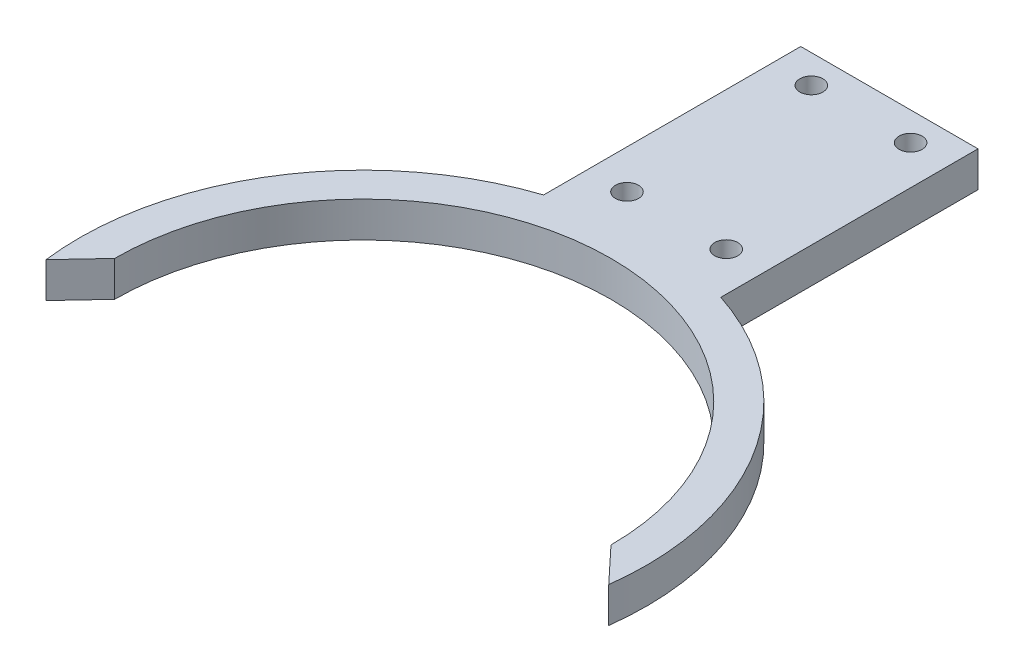
ISO-10303-21;
HEADER;
FILE_DESCRIPTION(('STEP AP214'),'2;1');
FILE_NAME('part.step','',(''),(''),'','','');
FILE_SCHEMA(('AUTOMOTIVE_DESIGN { 1 0 10303 214 1 1 1 1 }'));
ENDSEC;
DATA;
#1=APPLICATION_CONTEXT('core data for automotive mechanical design processes');
#2=APPLICATION_PROTOCOL_DEFINITION('international standard','automotive_design',2000,#1);
#3=PRODUCT_CONTEXT('',#1,'mechanical');
#4=PRODUCT('Part','Part','',(#3));
#5=PRODUCT_RELATED_PRODUCT_CATEGORY('part','',(#4));
#6=PRODUCT_DEFINITION_FORMATION('','',#4);
#7=PRODUCT_DEFINITION_CONTEXT('part definition',#1,'design');
#8=PRODUCT_DEFINITION('design','',#6,#7);
#9=PRODUCT_DEFINITION_SHAPE('','',#8);
#10=(LENGTH_UNIT() NAMED_UNIT(*) SI_UNIT(.MILLI.,.METRE.));
#11=(NAMED_UNIT(*) PLANE_ANGLE_UNIT() SI_UNIT($,.RADIAN.));
#12=(NAMED_UNIT(*) SI_UNIT($,.STERADIAN.) SOLID_ANGLE_UNIT());
#13=UNCERTAINTY_MEASURE_WITH_UNIT(LENGTH_MEASURE(1.E-05),#10,'distance_accuracy_value','');
#14=(GEOMETRIC_REPRESENTATION_CONTEXT(3) GLOBAL_UNCERTAINTY_ASSIGNED_CONTEXT((#13)) GLOBAL_UNIT_ASSIGNED_CONTEXT((#10,
#11,#12)) REPRESENTATION_CONTEXT('',''));
#15=CARTESIAN_POINT('',(0.,0.,0.));
#16=DIRECTION('',(0.,0.,1.));
#17=DIRECTION('',(1.,0.,0.));
#18=AXIS2_PLACEMENT_3D('',#15,#16,#17);
#19=CARTESIAN_POINT('',(2.5,5.,34.2668769218525));
#20=DIRECTION('',(0.,-1.,0.));
#21=DIRECTION('',(0.,0.,-1.));
#22=AXIS2_PLACEMENT_3D('',#19,#20,#21);
#23=PLANE('',#22);
#24=CARTESIAN_POINT('',(9.49999999999999,5.,-35.992204685627));
#25=DIRECTION('',(0.,1.,0.));
#26=DIRECTION('',(0.,0.,-1.));
#27=AXIS2_PLACEMENT_3D('',#24,#25,#26);
#28=CIRCLE('',#27,1.625);
#29=CARTESIAN_POINT('',(9.49999999999999,5.,-37.617204685627));
#30=VERTEX_POINT('',#29);
#31=EDGE_CURVE('E188',#30,#30,#28,.T.);
#32=ORIENTED_EDGE('',*,*,#31,.F.);
#33=EDGE_LOOP('',(#32));
#34=FACE_BOUND('',#33,.T.);
#35=CARTESIAN_POINT('',(-4.50000000000001,5.,-9.992204685627));
#36=DIRECTION('',(0.,1.,0.));
#37=DIRECTION('',(0.,0.,1.));
#38=AXIS2_PLACEMENT_3D('',#35,#36,#37);
#39=CIRCLE('',#38,1.625);
#40=CARTESIAN_POINT('',(-4.50000000000001,5.,-8.367204685627));
#41=VERTEX_POINT('',#40);
#42=EDGE_CURVE('E134',#41,#41,#39,.T.);
#43=ORIENTED_EDGE('',*,*,#42,.F.);
#44=EDGE_LOOP('',(#43));
#45=FACE_BOUND('',#44,.T.);
#46=DIRECTION('',(0.,0.,-1.));
#47=VECTOR('',#46,1.);
#48=CARTESIAN_POINT('',(15.,5.,-40.));
#49=LINE('',#48,#47);
#50=CARTESIAN_POINT('',(15.,5.,-3.72983346207416));
#51=VERTEX_POINT('',#50);
#52=CARTESIAN_POINT('',(15.,5.,-40.));
#53=VERTEX_POINT('',#52);
#54=EDGE_CURVE('E145',#51,#53,#49,.T.);
#55=ORIENTED_EDGE('',*,*,#54,.T.);
#56=DIRECTION('',(-1.,0.,0.));
#57=VECTOR('',#56,1.);
#58=CARTESIAN_POINT('',(15.,5.,-40.));
#59=LINE('',#58,#57);
#60=CARTESIAN_POINT('',(-10.,5.,-40.));
#61=VERTEX_POINT('',#60);
#62=EDGE_CURVE('E93',#53,#61,#59,.T.);
#63=ORIENTED_EDGE('',*,*,#62,.T.);
#64=DIRECTION('',(0.,0.,1.));
#65=VECTOR('',#64,1.);
#66=CARTESIAN_POINT('',(-10.,5.,-40.));
#67=LINE('',#66,#65);
#68=CARTESIAN_POINT('',(-10.,5.,-3.72983346207416));
#69=VERTEX_POINT('',#68);
#70=EDGE_CURVE('E160',#61,#69,#67,.T.);
#71=ORIENTED_EDGE('',*,*,#70,.T.);
#72=CARTESIAN_POINT('',(2.5,5.,34.2668769218525));
#73=DIRECTION('',(0.,1.,0.));
#74=DIRECTION('',(0.,0.,1.));
#75=AXIS2_PLACEMENT_3D('',#72,#73,#74);
#76=CIRCLE('',#75,40.);
#77=CARTESIAN_POINT('',(-37.1862696659689,5.,39.2668769218525));
#78=VERTEX_POINT('',#77);
#79=EDGE_CURVE('E173',#69,#78,#76,.T.);
#80=ORIENTED_EDGE('',*,*,#79,.T.);
#81=DIRECTION('',(0.683845569055321,0.,-0.729626779719196));
#82=VECTOR('',#81,1.);
#83=CARTESIAN_POINT('',(-32.5,5.,34.2668769218525));
#84=LINE('',#83,#82);
#85=CARTESIAN_POINT('',(-32.5,5.,34.2668769218525));
#86=VERTEX_POINT('',#85);
#87=EDGE_CURVE('E112',#78,#86,#84,.T.);
#88=ORIENTED_EDGE('',*,*,#87,.T.);
#89=CARTESIAN_POINT('',(2.5,5.,34.2668769218525));
#90=DIRECTION('',(0.,-1.,0.));
#91=DIRECTION('',(0.,0.,1.));
#92=AXIS2_PLACEMENT_3D('',#89,#90,#91);
#93=CIRCLE('',#92,35.);
#94=CARTESIAN_POINT('',(37.5,5.,34.2668769218525));
#95=VERTEX_POINT('',#94);
#96=EDGE_CURVE('E106',#86,#95,#93,.T.);
#97=ORIENTED_EDGE('',*,*,#96,.T.);
#98=DIRECTION('',(0.683845569055321,0.,0.729626779719196));
#99=VECTOR('',#98,1.);
#100=CARTESIAN_POINT('',(37.5,5.,34.2668769218525));
#101=LINE('',#100,#99);
#102=CARTESIAN_POINT('',(42.1862696659689,5.,39.2668769218525));
#103=VERTEX_POINT('',#102);
#104=EDGE_CURVE('E110',#95,#103,#101,.T.);
#105=ORIENTED_EDGE('',*,*,#104,.T.);
#106=CARTESIAN_POINT('',(2.5,5.,34.2668769218525));
#107=DIRECTION('',(0.,1.,0.));
#108=DIRECTION('',(0.,0.,-1.));
#109=AXIS2_PLACEMENT_3D('',#106,#107,#108);
#110=CIRCLE('',#109,40.);
#111=EDGE_CURVE('E50',#103,#51,#110,.T.);
#112=ORIENTED_EDGE('',*,*,#111,.T.);
#113=EDGE_LOOP('',(#55,#63,#71,#80,#88,#97,#105,#112));
#114=FACE_BOUND('',#113,.T.);
#115=CARTESIAN_POINT('',(-4.50000000000001,5.,-35.992204685627));
#116=DIRECTION('',(0.,1.,0.));
#117=DIRECTION('',(0.,0.,1.));
#118=AXIS2_PLACEMENT_3D('',#115,#116,#117);
#119=CIRCLE('',#118,1.625);
#120=CARTESIAN_POINT('',(-4.50000000000001,5.,-34.367204685627));
#121=VERTEX_POINT('',#120);
#122=EDGE_CURVE('E182',#121,#121,#119,.T.);
#123=ORIENTED_EDGE('',*,*,#122,.F.);
#124=EDGE_LOOP('',(#123));
#125=FACE_BOUND('',#124,.T.);
#126=CARTESIAN_POINT('',(9.5,5.,-9.992204685627));
#127=DIRECTION('',(0.,1.,0.));
#128=DIRECTION('',(0.,0.,-1.));
#129=AXIS2_PLACEMENT_3D('',#126,#127,#128);
#130=CIRCLE('',#129,1.625);
#131=CARTESIAN_POINT('',(9.5,5.,-11.617204685627));
#132=VERTEX_POINT('',#131);
#133=EDGE_CURVE('E194',#132,#132,#130,.T.);
#134=ORIENTED_EDGE('',*,*,#133,.F.);
#135=EDGE_LOOP('',(#134));
#136=FACE_BOUND('',#135,.T.);
#137=ADVANCED_FACE('F33',(#34,#45,#114,#125,#136),#23,.F.);
#138=CARTESIAN_POINT('',(2.5,0.,34.2668769218525));
#139=DIRECTION('',(0.,-1.,0.));
#140=DIRECTION('',(0.,0.,-1.));
#141=AXIS2_PLACEMENT_3D('',#138,#139,#140);
#142=PLANE('',#141);
#143=CARTESIAN_POINT('',(9.49999999999999,0.,-35.992204685627));
#144=DIRECTION('',(0.,1.,0.));
#145=DIRECTION('',(0.,0.,-1.));
#146=AXIS2_PLACEMENT_3D('',#143,#144,#145);
#147=CIRCLE('',#146,1.625);
#148=CARTESIAN_POINT('',(9.49999999999999,0.,-37.617204685627));
#149=VERTEX_POINT('',#148);
#150=EDGE_CURVE('E191',#149,#149,#147,.T.);
#151=ORIENTED_EDGE('',*,*,#150,.T.);
#152=EDGE_LOOP('',(#151));
#153=FACE_BOUND('',#152,.T.);
#154=CARTESIAN_POINT('',(-4.50000000000001,0.,-9.992204685627));
#155=DIRECTION('',(0.,1.,0.));
#156=DIRECTION('',(0.,0.,1.));
#157=AXIS2_PLACEMENT_3D('',#154,#155,#156);
#158=CIRCLE('',#157,1.625);
#159=CARTESIAN_POINT('',(-4.50000000000001,0.,-8.367204685627));
#160=VERTEX_POINT('',#159);
#161=EDGE_CURVE('E179',#160,#160,#158,.T.);
#162=ORIENTED_EDGE('',*,*,#161,.T.);
#163=EDGE_LOOP('',(#162));
#164=FACE_BOUND('',#163,.T.);
#165=DIRECTION('',(0.,0.,-1.));
#166=VECTOR('',#165,1.);
#167=CARTESIAN_POINT('',(15.,0.,-40.));
#168=LINE('',#167,#166);
#169=CARTESIAN_POINT('',(15.,0.,-3.72983346207416));
#170=VERTEX_POINT('',#169);
#171=CARTESIAN_POINT('',(15.,0.,-40.));
#172=VERTEX_POINT('',#171);
#173=EDGE_CURVE('E130',#170,#172,#168,.T.);
#174=ORIENTED_EDGE('',*,*,#173,.F.);
#175=CARTESIAN_POINT('',(2.5,0.,34.2668769218525));
#176=DIRECTION('',(0.,1.,0.));
#177=DIRECTION('',(0.,0.,-1.));
#178=AXIS2_PLACEMENT_3D('',#175,#176,#177);
#179=CIRCLE('',#178,40.);
#180=CARTESIAN_POINT('',(42.1862696659689,0.,39.2668769218525));
#181=VERTEX_POINT('',#180);
#182=EDGE_CURVE('E85',#181,#170,#179,.T.);
#183=ORIENTED_EDGE('',*,*,#182,.F.);
#184=DIRECTION('',(0.683845569055321,0.,0.729626779719196));
#185=VECTOR('',#184,1.);
#186=CARTESIAN_POINT('',(37.5,0.,34.2668769218525));
#187=LINE('',#186,#185);
#188=CARTESIAN_POINT('',(37.5,0.,34.2668769218525));
#189=VERTEX_POINT('',#188);
#190=EDGE_CURVE('E79',#189,#181,#187,.T.);
#191=ORIENTED_EDGE('',*,*,#190,.F.);
#192=CARTESIAN_POINT('',(2.5,0.,34.2668769218525));
#193=DIRECTION('',(0.,-1.,0.));
#194=DIRECTION('',(0.,0.,1.));
#195=AXIS2_PLACEMENT_3D('',#192,#193,#194);
#196=CIRCLE('',#195,35.);
#197=CARTESIAN_POINT('',(-32.5,0.,34.2668769218525));
#198=VERTEX_POINT('',#197);
#199=EDGE_CURVE('E120',#198,#189,#196,.T.);
#200=ORIENTED_EDGE('',*,*,#199,.F.);
#201=DIRECTION('',(0.683845569055321,0.,-0.729626779719196));
#202=VECTOR('',#201,1.);
#203=CARTESIAN_POINT('',(-32.5,0.,34.2668769218525));
#204=LINE('',#203,#202);
#205=CARTESIAN_POINT('',(-37.1862696659689,0.,39.2668769218525));
#206=VERTEX_POINT('',#205);
#207=EDGE_CURVE('E140',#206,#198,#204,.T.);
#208=ORIENTED_EDGE('',*,*,#207,.F.);
#209=CARTESIAN_POINT('',(2.5,0.,34.2668769218525));
#210=DIRECTION('',(0.,1.,0.));
#211=DIRECTION('',(0.,0.,1.));
#212=AXIS2_PLACEMENT_3D('',#209,#210,#211);
#213=CIRCLE('',#212,40.);
#214=CARTESIAN_POINT('',(-10.,0.,-3.72983346207416));
#215=VERTEX_POINT('',#214);
#216=EDGE_CURVE('E138',#215,#206,#213,.T.);
#217=ORIENTED_EDGE('',*,*,#216,.F.);
#218=DIRECTION('',(0.,0.,1.));
#219=VECTOR('',#218,1.);
#220=CARTESIAN_POINT('',(-10.,0.,-40.));
#221=LINE('',#220,#219);
#222=CARTESIAN_POINT('',(-10.,0.,-40.));
#223=VERTEX_POINT('',#222);
#224=EDGE_CURVE('E136',#223,#215,#221,.T.);
#225=ORIENTED_EDGE('',*,*,#224,.F.);
#226=DIRECTION('',(-1.,0.,0.));
#227=VECTOR('',#226,1.);
#228=CARTESIAN_POINT('',(15.,0.,-40.));
#229=LINE('',#228,#227);
#230=EDGE_CURVE('E133',#172,#223,#229,.T.);
#231=ORIENTED_EDGE('',*,*,#230,.F.);
#232=EDGE_LOOP('',(#174,#183,#191,#200,#208,#217,#225,#231));
#233=FACE_BOUND('',#232,.T.);
#234=CARTESIAN_POINT('',(-4.50000000000001,0.,-35.992204685627));
#235=DIRECTION('',(0.,1.,0.));
#236=DIRECTION('',(0.,0.,1.));
#237=AXIS2_PLACEMENT_3D('',#234,#235,#236);
#238=CIRCLE('',#237,1.625);
#239=CARTESIAN_POINT('',(-4.50000000000001,0.,-34.367204685627));
#240=VERTEX_POINT('',#239);
#241=EDGE_CURVE('E185',#240,#240,#238,.T.);
#242=ORIENTED_EDGE('',*,*,#241,.T.);
#243=EDGE_LOOP('',(#242));
#244=FACE_BOUND('',#243,.T.);
#245=CARTESIAN_POINT('',(9.5,0.,-9.992204685627));
#246=DIRECTION('',(0.,1.,0.));
#247=DIRECTION('',(0.,0.,-1.));
#248=AXIS2_PLACEMENT_3D('',#245,#246,#247);
#249=CIRCLE('',#248,1.625);
#250=CARTESIAN_POINT('',(9.5,0.,-11.617204685627));
#251=VERTEX_POINT('',#250);
#252=EDGE_CURVE('E197',#251,#251,#249,.T.);
#253=ORIENTED_EDGE('',*,*,#252,.T.);
#254=EDGE_LOOP('',(#253));
#255=FACE_BOUND('',#254,.T.);
#256=ADVANCED_FACE('F164',(#153,#164,#233,#244,#255),#142,.T.);
#257=CARTESIAN_POINT('',(15.,5.,-40.));
#258=DIRECTION('',(-1.,0.,0.));
#259=DIRECTION('',(0.,0.,1.));
#260=AXIS2_PLACEMENT_3D('',#257,#258,#259);
#261=PLANE('',#260);
#262=ORIENTED_EDGE('',*,*,#173,.T.);
#263=DIRECTION('',(0.,-1.,0.));
#264=VECTOR('',#263,1.);
#265=CARTESIAN_POINT('',(15.,5.,-40.));
#266=LINE('',#265,#264);
#267=EDGE_CURVE('E11',#53,#172,#266,.T.);
#268=ORIENTED_EDGE('',*,*,#267,.F.);
#269=ORIENTED_EDGE('',*,*,#54,.F.);
#270=DIRECTION('',(0.,-1.,0.));
#271=VECTOR('',#270,1.);
#272=CARTESIAN_POINT('',(15.,5.,-3.72983346207416));
#273=LINE('',#272,#271);
#274=EDGE_CURVE('E126',#51,#170,#273,.T.);
#275=ORIENTED_EDGE('',*,*,#274,.T.);
#276=EDGE_LOOP('',(#262,#268,#269,#275));
#277=FACE_BOUND('',#276,.T.);
#278=ADVANCED_FACE('F35',(#277),#261,.F.);
#279=CARTESIAN_POINT('',(15.,5.,-40.));
#280=DIRECTION('',(0.,0.,1.));
#281=DIRECTION('',(1.,0.,0.));
#282=AXIS2_PLACEMENT_3D('',#279,#280,#281);
#283=PLANE('',#282);
#284=ORIENTED_EDGE('',*,*,#230,.T.);
#285=DIRECTION('',(0.,-1.,0.));
#286=VECTOR('',#285,1.);
#287=CARTESIAN_POINT('',(-10.,5.,-40.));
#288=LINE('',#287,#286);
#289=EDGE_CURVE('E42',#61,#223,#288,.T.);
#290=ORIENTED_EDGE('',*,*,#289,.F.);
#291=ORIENTED_EDGE('',*,*,#62,.F.);
#292=ORIENTED_EDGE('',*,*,#267,.T.);
#293=EDGE_LOOP('',(#284,#290,#291,#292));
#294=FACE_BOUND('',#293,.T.);
#295=ADVANCED_FACE('F232',(#294),#283,.F.);
#296=CARTESIAN_POINT('',(-10.,5.,-40.));
#297=DIRECTION('',(1.,0.,0.));
#298=DIRECTION('',(0.,0.,-1.));
#299=AXIS2_PLACEMENT_3D('',#296,#297,#298);
#300=PLANE('',#299);
#301=ORIENTED_EDGE('',*,*,#224,.T.);
#302=DIRECTION('',(0.,-1.,0.));
#303=VECTOR('',#302,1.);
#304=CARTESIAN_POINT('',(-10.,5.,-3.72983346207416));
#305=LINE('',#304,#303);
#306=EDGE_CURVE('E152',#69,#215,#305,.T.);
#307=ORIENTED_EDGE('',*,*,#306,.F.);
#308=ORIENTED_EDGE('',*,*,#70,.F.);
#309=ORIENTED_EDGE('',*,*,#289,.T.);
#310=EDGE_LOOP('',(#301,#307,#308,#309));
#311=FACE_BOUND('',#310,.T.);
#312=ADVANCED_FACE('F158',(#311),#300,.F.);
#313=CARTESIAN_POINT('',(2.5,5.,34.2668769218525));
#314=DIRECTION('',(0.,-1.,0.));
#315=DIRECTION('',(0.,0.,-1.));
#316=AXIS2_PLACEMENT_3D('',#313,#314,#315);
#317=CYLINDRICAL_SURFACE('',#316,40.);
#318=ORIENTED_EDGE('',*,*,#216,.T.);
#319=DIRECTION('',(0.,-1.,0.));
#320=VECTOR('',#319,1.);
#321=CARTESIAN_POINT('',(-37.1862696659689,5.,39.2668769218525));
#322=LINE('',#321,#320);
#323=EDGE_CURVE('E149',#78,#206,#322,.T.);
#324=ORIENTED_EDGE('',*,*,#323,.F.);
#325=ORIENTED_EDGE('',*,*,#79,.F.);
#326=ORIENTED_EDGE('',*,*,#306,.T.);
#327=EDGE_LOOP('',(#318,#324,#325,#326));
#328=FACE_BOUND('',#327,.T.);
#329=ADVANCED_FACE('F169',(#328),#317,.T.);
#330=CARTESIAN_POINT('',(-32.5,5.,34.2668769218525));
#331=DIRECTION('',(-0.729626779719196,0.,-0.683845569055321));
#332=DIRECTION('',(-0.683845569055321,0.,0.729626779719196));
#333=AXIS2_PLACEMENT_3D('',#330,#331,#332);
#334=PLANE('',#333);
#335=ORIENTED_EDGE('',*,*,#207,.T.);
#336=DIRECTION('',(0.,-1.,0.));
#337=VECTOR('',#336,1.);
#338=CARTESIAN_POINT('',(-32.5,5.,34.2668769218525));
#339=LINE('',#338,#337);
#340=EDGE_CURVE('E121',#86,#198,#339,.T.);
#341=ORIENTED_EDGE('',*,*,#340,.F.);
#342=ORIENTED_EDGE('',*,*,#87,.F.);
#343=ORIENTED_EDGE('',*,*,#323,.T.);
#344=EDGE_LOOP('',(#335,#341,#342,#343));
#345=FACE_BOUND('',#344,.T.);
#346=ADVANCED_FACE('F172',(#345),#334,.F.);
#347=CARTESIAN_POINT('',(2.5,5.,34.2668769218525));
#348=DIRECTION('',(0.,-1.,0.));
#349=DIRECTION('',(0.,0.,-1.));
#350=AXIS2_PLACEMENT_3D('',#347,#348,#349);
#351=CYLINDRICAL_SURFACE('',#350,35.);
#352=ORIENTED_EDGE('',*,*,#199,.T.);
#353=DIRECTION('',(0.,-1.,0.));
#354=VECTOR('',#353,1.);
#355=CARTESIAN_POINT('',(37.5,5.,34.2668769218525));
#356=LINE('',#355,#354);
#357=EDGE_CURVE('E117',#95,#189,#356,.T.);
#358=ORIENTED_EDGE('',*,*,#357,.F.);
#359=ORIENTED_EDGE('',*,*,#96,.F.);
#360=ORIENTED_EDGE('',*,*,#340,.T.);
#361=EDGE_LOOP('',(#352,#358,#359,#360));
#362=FACE_BOUND('',#361,.T.);
#363=ADVANCED_FACE('F118',(#362),#351,.F.);
#364=CARTESIAN_POINT('',(37.5,5.,34.2668769218525));
#365=DIRECTION('',(0.729626779719196,0.,-0.683845569055321));
#366=DIRECTION('',(-0.683845569055321,0.,-0.729626779719196));
#367=AXIS2_PLACEMENT_3D('',#364,#365,#366);
#368=PLANE('',#367);
#369=ORIENTED_EDGE('',*,*,#190,.T.);
#370=DIRECTION('',(0.,-1.,0.));
#371=VECTOR('',#370,1.);
#372=CARTESIAN_POINT('',(42.1862696659689,5.,39.2668769218525));
#373=LINE('',#372,#371);
#374=EDGE_CURVE('E122',#103,#181,#373,.T.);
#375=ORIENTED_EDGE('',*,*,#374,.F.);
#376=ORIENTED_EDGE('',*,*,#104,.F.);
#377=ORIENTED_EDGE('',*,*,#357,.T.);
#378=EDGE_LOOP('',(#369,#375,#376,#377));
#379=FACE_BOUND('',#378,.T.);
#380=ADVANCED_FACE('F124',(#379),#368,.F.);
#381=CARTESIAN_POINT('',(2.5,5.,34.2668769218525));
#382=DIRECTION('',(0.,-1.,0.));
#383=DIRECTION('',(0.,0.,-1.));
#384=AXIS2_PLACEMENT_3D('',#381,#382,#383);
#385=CYLINDRICAL_SURFACE('',#384,40.);
#386=ORIENTED_EDGE('',*,*,#182,.T.);
#387=ORIENTED_EDGE('',*,*,#274,.F.);
#388=ORIENTED_EDGE('',*,*,#111,.F.);
#389=ORIENTED_EDGE('',*,*,#374,.T.);
#390=EDGE_LOOP('',(#386,#387,#388,#389));
#391=FACE_BOUND('',#390,.T.);
#392=ADVANCED_FACE('F220',(#391),#385,.T.);
#393=CARTESIAN_POINT('',(-4.50000000000001,5.,-9.992204685627));
#394=DIRECTION('',(0.,-1.,0.));
#395=DIRECTION('',(0.,0.,-1.));
#396=AXIS2_PLACEMENT_3D('',#393,#394,#395);
#397=CYLINDRICAL_SURFACE('',#396,1.625);
#398=ORIENTED_EDGE('',*,*,#42,.T.);
#399=EDGE_LOOP('',(#398));
#400=FACE_BOUND('',#399,.T.);
#401=ORIENTED_EDGE('',*,*,#161,.F.);
#402=EDGE_LOOP('',(#401));
#403=FACE_BOUND('',#402,.T.);
#404=ADVANCED_FACE('F217',(#400,#403),#397,.F.);
#405=CARTESIAN_POINT('',(-4.50000000000001,5.,-35.992204685627));
#406=DIRECTION('',(0.,-1.,0.));
#407=DIRECTION('',(0.,0.,-1.));
#408=AXIS2_PLACEMENT_3D('',#405,#406,#407);
#409=CYLINDRICAL_SURFACE('',#408,1.625);
#410=ORIENTED_EDGE('',*,*,#122,.T.);
#411=EDGE_LOOP('',(#410));
#412=FACE_BOUND('',#411,.T.);
#413=ORIENTED_EDGE('',*,*,#241,.F.);
#414=EDGE_LOOP('',(#413));
#415=FACE_BOUND('',#414,.T.);
#416=ADVANCED_FACE('F296',(#412,#415),#409,.F.);
#417=CARTESIAN_POINT('',(9.49999999999999,5.,-35.992204685627));
#418=DIRECTION('',(0.,-1.,0.));
#419=DIRECTION('',(0.,0.,-1.));
#420=AXIS2_PLACEMENT_3D('',#417,#418,#419);
#421=CYLINDRICAL_SURFACE('',#420,1.625);
#422=ORIENTED_EDGE('',*,*,#31,.T.);
#423=EDGE_LOOP('',(#422));
#424=FACE_BOUND('',#423,.T.);
#425=ORIENTED_EDGE('',*,*,#150,.F.);
#426=EDGE_LOOP('',(#425));
#427=FACE_BOUND('',#426,.T.);
#428=ADVANCED_FACE('F304',(#424,#427),#421,.F.);
#429=CARTESIAN_POINT('',(9.5,5.,-9.992204685627));
#430=DIRECTION('',(0.,-1.,0.));
#431=DIRECTION('',(0.,0.,-1.));
#432=AXIS2_PLACEMENT_3D('',#429,#430,#431);
#433=CYLINDRICAL_SURFACE('',#432,1.625);
#434=ORIENTED_EDGE('',*,*,#133,.T.);
#435=EDGE_LOOP('',(#434));
#436=FACE_BOUND('',#435,.T.);
#437=ORIENTED_EDGE('',*,*,#252,.F.);
#438=EDGE_LOOP('',(#437));
#439=FACE_BOUND('',#438,.T.);
#440=ADVANCED_FACE('F203',(#436,#439),#433,.F.);
#441=CLOSED_SHELL('',(#137,#256,#278,#295,#312,#329,#346,#363,#380,#392,#404,#416,#428,#440));
#442=MANIFOLD_SOLID_BREP('B2',#441);
#443=ADVANCED_BREP_SHAPE_REPRESENTATION('',(#18,#442),#14);
#444=SHAPE_DEFINITION_REPRESENTATION(#9,#443);
ENDSEC;
END-ISO-10303-21;
